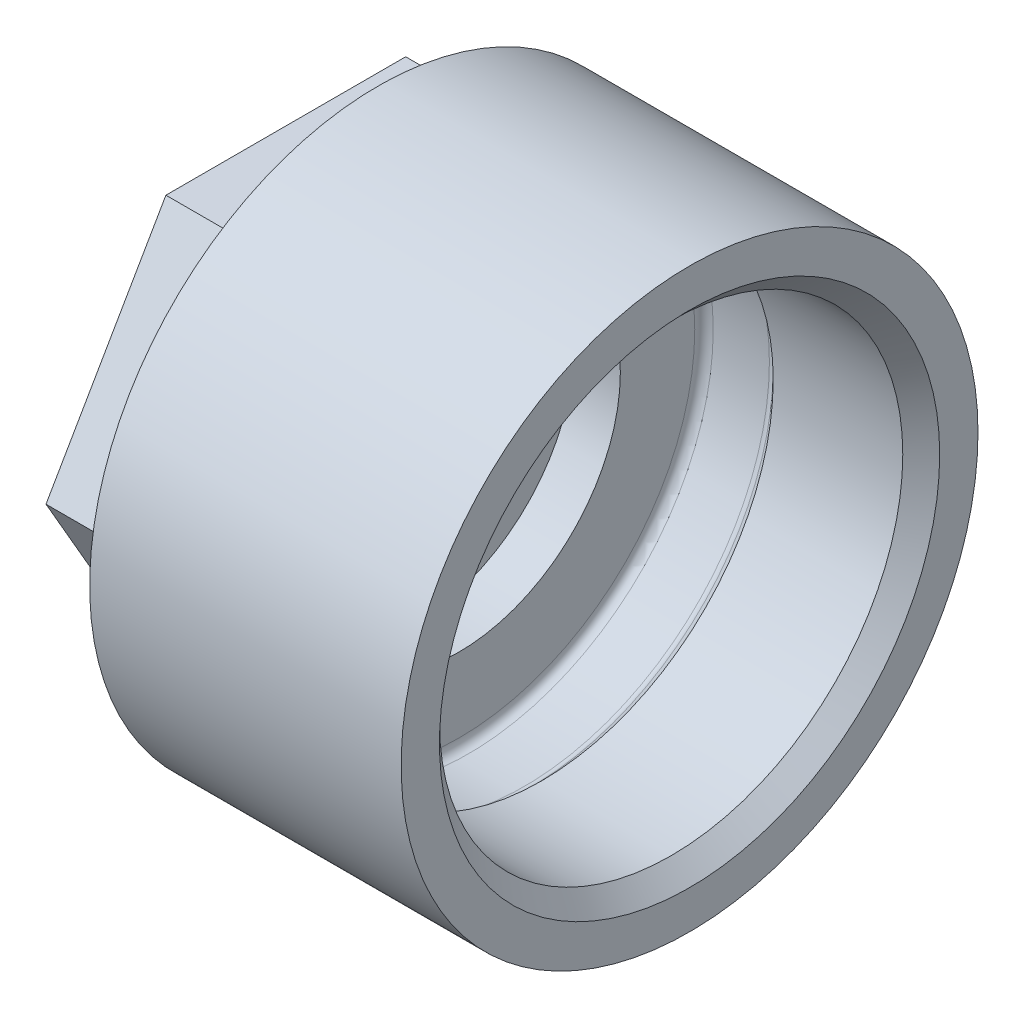
ISO-10303-21;
HEADER;
FILE_DESCRIPTION(('STEP AP214'),'2;1');
FILE_NAME('part.step','',(''),(''),'','','');
FILE_SCHEMA(('AUTOMOTIVE_DESIGN { 1 0 10303 214 1 1 1 1 }'));
ENDSEC;
DATA;
#1=APPLICATION_CONTEXT('core data for automotive mechanical design processes');
#2=APPLICATION_PROTOCOL_DEFINITION('international standard','automotive_design',2000,#1);
#3=PRODUCT_CONTEXT('',#1,'mechanical');
#4=PRODUCT('Part','Part','',(#3));
#5=PRODUCT_RELATED_PRODUCT_CATEGORY('part','',(#4));
#6=PRODUCT_DEFINITION_FORMATION('','',#4);
#7=PRODUCT_DEFINITION_CONTEXT('part definition',#1,'design');
#8=PRODUCT_DEFINITION('design','',#6,#7);
#9=PRODUCT_DEFINITION_SHAPE('','',#8);
#10=(LENGTH_UNIT() NAMED_UNIT(*) SI_UNIT(.MILLI.,.METRE.));
#11=(NAMED_UNIT(*) PLANE_ANGLE_UNIT() SI_UNIT($,.RADIAN.));
#12=(NAMED_UNIT(*) SI_UNIT($,.STERADIAN.) SOLID_ANGLE_UNIT());
#13=UNCERTAINTY_MEASURE_WITH_UNIT(LENGTH_MEASURE(1.E-05),#10,'distance_accuracy_value','');
#14=(GEOMETRIC_REPRESENTATION_CONTEXT(3) GLOBAL_UNCERTAINTY_ASSIGNED_CONTEXT((#13)) GLOBAL_UNIT_ASSIGNED_CONTEXT((#10,
#11,#12)) REPRESENTATION_CONTEXT('',''));
#15=CARTESIAN_POINT('',(0.,0.,0.));
#16=DIRECTION('',(0.,0.,1.));
#17=DIRECTION('',(1.,0.,0.));
#18=AXIS2_PLACEMENT_3D('',#15,#16,#17);
#19=CARTESIAN_POINT('',(-35.,21.,0.));
#20=DIRECTION('',(-1.,0.,0.));
#21=DIRECTION('',(0.,0.,1.));
#22=AXIS2_PLACEMENT_3D('',#19,#20,#21);
#23=PLANE('',#22);
#24=CARTESIAN_POINT('',(-35.,0.,0.));
#25=DIRECTION('',(1.,0.,0.));
#26=DIRECTION('',(0.,0.,-1.));
#27=AXIS2_PLACEMENT_3D('',#24,#25,#26);
#28=CIRCLE('',#27,2.);
#29=CARTESIAN_POINT('',(-35.,0.,-2.));
#30=VERTEX_POINT('',#29);
#31=EDGE_CURVE('E152',#30,#30,#28,.T.);
#32=ORIENTED_EDGE('',*,*,#31,.T.);
#33=EDGE_LOOP('',(#32));
#34=FACE_BOUND('',#33,.T.);
#35=DIRECTION('',(0.,0.,1.));
#36=VECTOR('',#35,1.);
#37=CARTESIAN_POINT('',(-35.,-18.,-10.3923048454133));
#38=LINE('',#37,#36);
#39=CARTESIAN_POINT('',(-35.,-18.,-10.3923048454133));
#40=VERTEX_POINT('',#39);
#41=CARTESIAN_POINT('',(-35.,-18.,10.3923048454132));
#42=VERTEX_POINT('',#41);
#43=EDGE_CURVE('E115',#40,#42,#38,.T.);
#44=ORIENTED_EDGE('',*,*,#43,.T.);
#45=DIRECTION('',(0.,0.866025403784438,0.5));
#46=VECTOR('',#45,1.);
#47=CARTESIAN_POINT('',(-35.,-18.,10.3923048454132));
#48=LINE('',#47,#46);
#49=CARTESIAN_POINT('',(-35.,0.,20.7846096908265));
#50=VERTEX_POINT('',#49);
#51=EDGE_CURVE('E129',#42,#50,#48,.T.);
#52=ORIENTED_EDGE('',*,*,#51,.T.);
#53=DIRECTION('',(0.,0.866025403784439,-0.499999999999999));
#54=VECTOR('',#53,1.);
#55=CARTESIAN_POINT('',(-35.,0.,20.7846096908265));
#56=LINE('',#55,#54);
#57=CARTESIAN_POINT('',(-35.,18.,10.3923048454133));
#58=VERTEX_POINT('',#57);
#59=EDGE_CURVE('E99',#50,#58,#56,.T.);
#60=ORIENTED_EDGE('',*,*,#59,.T.);
#61=DIRECTION('',(0.,0.,-1.));
#62=VECTOR('',#61,1.);
#63=CARTESIAN_POINT('',(-35.,18.,10.3923048454133));
#64=LINE('',#63,#62);
#65=CARTESIAN_POINT('',(-35.,18.,-10.3923048454132));
#66=VERTEX_POINT('',#65);
#67=EDGE_CURVE('E55',#58,#66,#64,.T.);
#68=ORIENTED_EDGE('',*,*,#67,.T.);
#69=DIRECTION('',(0.,-0.866025403784438,-0.5));
#70=VECTOR('',#69,1.);
#71=CARTESIAN_POINT('',(-35.,18.,-10.3923048454132));
#72=LINE('',#71,#70);
#73=CARTESIAN_POINT('',(-35.,0.,-20.7846096908265));
#74=VERTEX_POINT('',#73);
#75=EDGE_CURVE('E133',#66,#74,#72,.T.);
#76=ORIENTED_EDGE('',*,*,#75,.T.);
#77=DIRECTION('',(0.,-0.866025403784439,0.5));
#78=VECTOR('',#77,1.);
#79=CARTESIAN_POINT('',(-35.,0.,-20.7846096908265));
#80=LINE('',#79,#78);
#81=EDGE_CURVE('E118',#74,#40,#80,.T.);
#82=ORIENTED_EDGE('',*,*,#81,.T.);
#83=EDGE_LOOP('',(#44,#52,#60,#68,#76,#82));
#84=FACE_BOUND('',#83,.T.);
#85=ADVANCED_FACE('F39',(#34,#84),#23,.T.);
#86=CARTESIAN_POINT('',(0.,0.,0.));
#87=DIRECTION('',(1.,0.,0.));
#88=DIRECTION('',(0.,0.,-1.));
#89=AXIS2_PLACEMENT_3D('',#86,#87,#88);
#90=CYLINDRICAL_SURFACE('',#89,21.);
#91=CARTESIAN_POINT('',(-27.,0.,0.));
#92=DIRECTION('',(1.,0.,0.));
#93=DIRECTION('',(0.,0.,-1.));
#94=AXIS2_PLACEMENT_3D('',#91,#92,#93);
#95=CIRCLE('',#94,21.);
#96=CARTESIAN_POINT('',(-27.,0.,-21.));
#97=VERTEX_POINT('',#96);
#98=EDGE_CURVE('E149',#97,#97,#95,.T.);
#99=ORIENTED_EDGE('',*,*,#98,.F.);
#100=EDGE_LOOP('',(#99));
#101=FACE_BOUND('',#100,.T.);
#102=CARTESIAN_POINT('',(-28.,0.,0.));
#103=DIRECTION('',(-1.,0.,0.));
#104=DIRECTION('',(0.,0.,1.));
#105=AXIS2_PLACEMENT_3D('',#102,#103,#104);
#106=CIRCLE('',#105,21.);
#107=CARTESIAN_POINT('',(-28.,0.,21.));
#108=VERTEX_POINT('',#107);
#109=EDGE_CURVE('E43',#108,#108,#106,.F.);
#110=ORIENTED_EDGE('',*,*,#109,.T.);
#111=EDGE_LOOP('',(#110));
#112=FACE_BOUND('',#111,.T.);
#113=ADVANCED_FACE('F197',(#101,#112),#90,.T.);
#114=CARTESIAN_POINT('',(0.,0.,0.));
#115=DIRECTION('',(1.,0.,0.));
#116=DIRECTION('',(0.,0.,-1.));
#117=AXIS2_PLACEMENT_3D('',#114,#115,#116);
#118=CYLINDRICAL_SURFACE('',#117,25.);
#119=CARTESIAN_POINT('',(-27.,0.,0.));
#120=DIRECTION('',(1.,0.,0.));
#121=DIRECTION('',(0.,0.,-1.));
#122=AXIS2_PLACEMENT_3D('',#119,#120,#121);
#123=CIRCLE('',#122,25.);
#124=CARTESIAN_POINT('',(-27.,0.,-25.));
#125=VERTEX_POINT('',#124);
#126=EDGE_CURVE('E146',#125,#125,#123,.T.);
#127=ORIENTED_EDGE('',*,*,#126,.T.);
#128=EDGE_LOOP('',(#127));
#129=FACE_BOUND('',#128,.T.);
#130=CARTESIAN_POINT('',(0.,0.,0.));
#131=DIRECTION('',(1.,0.,0.));
#132=DIRECTION('',(0.,0.,-1.));
#133=AXIS2_PLACEMENT_3D('',#130,#131,#132);
#134=CIRCLE('',#133,25.);
#135=CARTESIAN_POINT('',(0.,0.,-25.));
#136=VERTEX_POINT('',#135);
#137=EDGE_CURVE('E12',#136,#136,#134,.T.);
#138=ORIENTED_EDGE('',*,*,#137,.F.);
#139=EDGE_LOOP('',(#138));
#140=FACE_BOUND('',#139,.T.);
#141=ADVANCED_FACE('F41',(#129,#140),#118,.T.);
#142=CARTESIAN_POINT('',(0.,21.68,0.));
#143=DIRECTION('',(1.,0.,0.));
#144=DIRECTION('',(0.,0.,-1.));
#145=AXIS2_PLACEMENT_3D('',#142,#143,#144);
#146=PLANE('',#145);
#147=ORIENTED_EDGE('',*,*,#137,.T.);
#148=EDGE_LOOP('',(#147));
#149=FACE_BOUND('',#148,.T.);
#150=CARTESIAN_POINT('',(0.,0.,0.));
#151=DIRECTION('',(1.,0.,0.));
#152=DIRECTION('',(0.,0.,-1.));
#153=AXIS2_PLACEMENT_3D('',#150,#151,#152);
#154=CIRCLE('',#153,21.68);
#155=CARTESIAN_POINT('',(0.,0.,-21.68));
#156=VERTEX_POINT('',#155);
#157=EDGE_CURVE('E48',#156,#156,#154,.T.);
#158=ORIENTED_EDGE('',*,*,#157,.F.);
#159=EDGE_LOOP('',(#158));
#160=FACE_BOUND('',#159,.T.);
#161=ADVANCED_FACE('F188',(#149,#160),#146,.T.);
#162=CARTESIAN_POINT('',(-1.6,0.,0.));
#163=DIRECTION('',(1.,0.,0.));
#164=DIRECTION('',(0.,0.,-1.));
#165=AXIS2_PLACEMENT_3D('',#162,#163,#164);
#166=CONICAL_SURFACE('',#165,20.08,0.785398163397445);
#167=ORIENTED_EDGE('',*,*,#157,.T.);
#168=EDGE_LOOP('',(#167));
#169=FACE_BOUND('',#168,.T.);
#170=CARTESIAN_POINT('',(-1.6,0.,0.));
#171=DIRECTION('',(1.,0.,0.));
#172=DIRECTION('',(0.,0.,-1.));
#173=AXIS2_PLACEMENT_3D('',#170,#171,#172);
#174=CIRCLE('',#173,20.08);
#175=CARTESIAN_POINT('',(-1.6,0.,-20.08));
#176=VERTEX_POINT('',#175);
#177=EDGE_CURVE('E179',#176,#176,#174,.T.);
#178=ORIENTED_EDGE('',*,*,#177,.F.);
#179=EDGE_LOOP('',(#178));
#180=FACE_BOUND('',#179,.T.);
#181=ADVANCED_FACE('F185',(#169,#180),#166,.F.);
#182=CARTESIAN_POINT('',(0.,0.,0.));
#183=DIRECTION('',(1.,0.,0.));
#184=DIRECTION('',(0.,0.,-1.));
#185=AXIS2_PLACEMENT_3D('',#182,#183,#184);
#186=CYLINDRICAL_SURFACE('',#185,20.08);
#187=ORIENTED_EDGE('',*,*,#177,.T.);
#188=EDGE_LOOP('',(#187));
#189=FACE_BOUND('',#188,.T.);
#190=CARTESIAN_POINT('',(-12.83,0.,0.));
#191=DIRECTION('',(1.,0.,0.));
#192=DIRECTION('',(0.,0.,-1.));
#193=AXIS2_PLACEMENT_3D('',#190,#191,#192);
#194=CIRCLE('',#193,20.08);
#195=CARTESIAN_POINT('',(-12.83,0.,-20.08));
#196=VERTEX_POINT('',#195);
#197=EDGE_CURVE('E176',#196,#196,#194,.T.);
#198=ORIENTED_EDGE('',*,*,#197,.F.);
#199=EDGE_LOOP('',(#198));
#200=FACE_BOUND('',#199,.T.);
#201=ADVANCED_FACE('F195',(#189,#200),#186,.F.);
#202=CARTESIAN_POINT('',(-13.7656854249492,0.,0.));
#203=DIRECTION('',(-1.,0.,0.));
#204=DIRECTION('',(0.,0.,1.));
#205=AXIS2_PLACEMENT_3D('',#202,#203,#204);
#206=CONICAL_SURFACE('',#205,21.0156854249492,0.785398163397451);
#207=ORIENTED_EDGE('',*,*,#197,.T.);
#208=EDGE_LOOP('',(#207));
#209=FACE_BOUND('',#208,.T.);
#210=CARTESIAN_POINT('',(-13.7656854249492,0.,0.));
#211=DIRECTION('',(1.,0.,0.));
#212=DIRECTION('',(0.,0.,-1.));
#213=AXIS2_PLACEMENT_3D('',#210,#211,#212);
#214=CIRCLE('',#213,21.0156854249492);
#215=CARTESIAN_POINT('',(-13.7656854249492,0.,-21.0156854249492));
#216=VERTEX_POINT('',#215);
#217=EDGE_CURVE('E173',#216,#216,#214,.T.);
#218=ORIENTED_EDGE('',*,*,#217,.F.);
#219=EDGE_LOOP('',(#218));
#220=FACE_BOUND('',#219,.T.);
#221=ADVANCED_FACE('F238',(#209,#220),#206,.F.);
#222=CARTESIAN_POINT('',(-14.3313708498985,0.,0.));
#223=DIRECTION('',(1.,0.,0.));
#224=DIRECTION('',(0.,0.,-1.));
#225=AXIS2_PLACEMENT_3D('',#222,#223,#224);
#226=TOROIDAL_SURFACE('',#225,20.45,0.799999999999999);
#227=ORIENTED_EDGE('',*,*,#217,.T.);
#228=EDGE_LOOP('',(#227));
#229=FACE_BOUND('',#228,.T.);
#230=CARTESIAN_POINT('',(-14.3313708498985,0.,0.));
#231=DIRECTION('',(1.,0.,0.));
#232=DIRECTION('',(0.,0.,-1.));
#233=AXIS2_PLACEMENT_3D('',#230,#231,#232);
#234=CIRCLE('',#233,21.25);
#235=CARTESIAN_POINT('',(-14.3313708498985,0.,-21.25));
#236=VERTEX_POINT('',#235);
#237=EDGE_CURVE('E170',#236,#236,#234,.T.);
#238=ORIENTED_EDGE('',*,*,#237,.F.);
#239=EDGE_LOOP('',(#238));
#240=FACE_BOUND('',#239,.T.);
#241=ADVANCED_FACE('F234',(#229,#240),#226,.F.);
#242=CARTESIAN_POINT('',(0.,0.,0.));
#243=DIRECTION('',(1.,0.,0.));
#244=DIRECTION('',(0.,0.,-1.));
#245=AXIS2_PLACEMENT_3D('',#242,#243,#244);
#246=CYLINDRICAL_SURFACE('',#245,21.25);
#247=ORIENTED_EDGE('',*,*,#237,.T.);
#248=EDGE_LOOP('',(#247));
#249=FACE_BOUND('',#248,.T.);
#250=CARTESIAN_POINT('',(-19.2,0.,0.));
#251=DIRECTION('',(1.,0.,0.));
#252=DIRECTION('',(0.,0.,-1.));
#253=AXIS2_PLACEMENT_3D('',#250,#251,#252);
#254=CIRCLE('',#253,21.25);
#255=CARTESIAN_POINT('',(-19.2,0.,-21.25));
#256=VERTEX_POINT('',#255);
#257=EDGE_CURVE('E167',#256,#256,#254,.T.);
#258=ORIENTED_EDGE('',*,*,#257,.F.);
#259=EDGE_LOOP('',(#258));
#260=FACE_BOUND('',#259,.T.);
#261=ADVANCED_FACE('F230',(#249,#260),#246,.F.);
#262=CARTESIAN_POINT('',(-19.2,0.,0.));
#263=DIRECTION('',(1.,0.,0.));
#264=DIRECTION('',(0.,0.,-1.));
#265=AXIS2_PLACEMENT_3D('',#262,#263,#264);
#266=TOROIDAL_SURFACE('',#265,20.45,0.799999999999999);
#267=ORIENTED_EDGE('',*,*,#257,.T.);
#268=EDGE_LOOP('',(#267));
#269=FACE_BOUND('',#268,.T.);
#270=CARTESIAN_POINT('',(-20.,0.,0.));
#271=DIRECTION('',(1.,0.,0.));
#272=DIRECTION('',(0.,0.,-1.));
#273=AXIS2_PLACEMENT_3D('',#270,#271,#272);
#274=CIRCLE('',#273,20.45);
#275=CARTESIAN_POINT('',(-20.,0.,-20.45));
#276=VERTEX_POINT('',#275);
#277=EDGE_CURVE('E164',#276,#276,#274,.T.);
#278=ORIENTED_EDGE('',*,*,#277,.F.);
#279=EDGE_LOOP('',(#278));
#280=FACE_BOUND('',#279,.T.);
#281=ADVANCED_FACE('F226',(#269,#280),#266,.F.);
#282=CARTESIAN_POINT('',(-20.,14.,0.));
#283=DIRECTION('',(1.,0.,0.));
#284=DIRECTION('',(0.,0.,-1.));
#285=AXIS2_PLACEMENT_3D('',#282,#283,#284);
#286=PLANE('',#285);
#287=ORIENTED_EDGE('',*,*,#277,.T.);
#288=EDGE_LOOP('',(#287));
#289=FACE_BOUND('',#288,.T.);
#290=CARTESIAN_POINT('',(-20.,0.,0.));
#291=DIRECTION('',(1.,0.,0.));
#292=DIRECTION('',(0.,0.,-1.));
#293=AXIS2_PLACEMENT_3D('',#290,#291,#292);
#294=CIRCLE('',#293,14.);
#295=CARTESIAN_POINT('',(-20.,0.,-14.));
#296=VERTEX_POINT('',#295);
#297=EDGE_CURVE('E161',#296,#296,#294,.T.);
#298=ORIENTED_EDGE('',*,*,#297,.F.);
#299=EDGE_LOOP('',(#298));
#300=FACE_BOUND('',#299,.T.);
#301=ADVANCED_FACE('F222',(#289,#300),#286,.T.);
#302=CARTESIAN_POINT('',(0.,0.,0.));
#303=DIRECTION('',(1.,0.,0.));
#304=DIRECTION('',(0.,0.,-1.));
#305=AXIS2_PLACEMENT_3D('',#302,#303,#304);
#306=CYLINDRICAL_SURFACE('',#305,14.);
#307=ORIENTED_EDGE('',*,*,#297,.T.);
#308=EDGE_LOOP('',(#307));
#309=FACE_BOUND('',#308,.T.);
#310=CARTESIAN_POINT('',(-24.,0.,0.));
#311=DIRECTION('',(1.,0.,0.));
#312=DIRECTION('',(0.,0.,-1.));
#313=AXIS2_PLACEMENT_3D('',#310,#311,#312);
#314=CIRCLE('',#313,14.);
#315=CARTESIAN_POINT('',(-24.,0.,-14.));
#316=VERTEX_POINT('',#315);
#317=EDGE_CURVE('E158',#316,#316,#314,.T.);
#318=ORIENTED_EDGE('',*,*,#317,.F.);
#319=EDGE_LOOP('',(#318));
#320=FACE_BOUND('',#319,.T.);
#321=ADVANCED_FACE('F218',(#309,#320),#306,.F.);
#322=CARTESIAN_POINT('',(-24.,2.,0.));
#323=DIRECTION('',(1.,0.,0.));
#324=DIRECTION('',(0.,0.,-1.));
#325=AXIS2_PLACEMENT_3D('',#322,#323,#324);
#326=PLANE('',#325);
#327=ORIENTED_EDGE('',*,*,#317,.T.);
#328=EDGE_LOOP('',(#327));
#329=FACE_BOUND('',#328,.T.);
#330=CARTESIAN_POINT('',(-24.,0.,0.));
#331=DIRECTION('',(1.,0.,0.));
#332=DIRECTION('',(0.,0.,-1.));
#333=AXIS2_PLACEMENT_3D('',#330,#331,#332);
#334=CIRCLE('',#333,2.);
#335=CARTESIAN_POINT('',(-24.,0.,-2.));
#336=VERTEX_POINT('',#335);
#337=EDGE_CURVE('E155',#336,#336,#334,.T.);
#338=ORIENTED_EDGE('',*,*,#337,.F.);
#339=EDGE_LOOP('',(#338));
#340=FACE_BOUND('',#339,.T.);
#341=ADVANCED_FACE('F214',(#329,#340),#326,.T.);
#342=CARTESIAN_POINT('',(0.,0.,0.));
#343=DIRECTION('',(1.,0.,0.));
#344=DIRECTION('',(0.,0.,-1.));
#345=AXIS2_PLACEMENT_3D('',#342,#343,#344);
#346=CYLINDRICAL_SURFACE('',#345,2.);
#347=ORIENTED_EDGE('',*,*,#337,.T.);
#348=EDGE_LOOP('',(#347));
#349=FACE_BOUND('',#348,.T.);
#350=ORIENTED_EDGE('',*,*,#31,.F.);
#351=EDGE_LOOP('',(#350));
#352=FACE_BOUND('',#351,.T.);
#353=ADVANCED_FACE('F210',(#349,#352),#346,.F.);
#354=CARTESIAN_POINT('',(-27.,25.,0.));
#355=DIRECTION('',(-1.,0.,0.));
#356=DIRECTION('',(0.,0.,1.));
#357=AXIS2_PLACEMENT_3D('',#354,#355,#356);
#358=PLANE('',#357);
#359=ORIENTED_EDGE('',*,*,#98,.T.);
#360=EDGE_LOOP('',(#359));
#361=FACE_BOUND('',#360,.T.);
#362=ORIENTED_EDGE('',*,*,#126,.F.);
#363=EDGE_LOOP('',(#362));
#364=FACE_BOUND('',#363,.T.);
#365=ADVANCED_FACE('F213',(#361,#364),#358,.T.);
#366=CARTESIAN_POINT('',(-28.,0.,0.));
#367=DIRECTION('',(-1.,0.,0.));
#368=DIRECTION('',(0.,0.,1.));
#369=AXIS2_PLACEMENT_3D('',#366,#367,#368);
#370=PLANE('',#369);
#371=ORIENTED_EDGE('',*,*,#109,.F.);
#372=EDGE_LOOP('',(#371));
#373=FACE_BOUND('',#372,.T.);
#374=DIRECTION('',(0.,0.,1.));
#375=VECTOR('',#374,1.);
#376=CARTESIAN_POINT('',(-28.,-18.,-10.3923048454133));
#377=LINE('',#376,#375);
#378=CARTESIAN_POINT('',(-28.,-18.,-10.3923048454133));
#379=VERTEX_POINT('',#378);
#380=CARTESIAN_POINT('',(-28.,-18.,10.3923048454132));
#381=VERTEX_POINT('',#380);
#382=EDGE_CURVE('E105',#379,#381,#377,.T.);
#383=ORIENTED_EDGE('',*,*,#382,.F.);
#384=DIRECTION('',(0.,-0.866025403784439,0.5));
#385=VECTOR('',#384,1.);
#386=CARTESIAN_POINT('',(-28.,0.,-20.7846096908265));
#387=LINE('',#386,#385);
#388=CARTESIAN_POINT('',(-28.,0.,-20.7846096908265));
#389=VERTEX_POINT('',#388);
#390=EDGE_CURVE('E125',#389,#379,#387,.T.);
#391=ORIENTED_EDGE('',*,*,#390,.F.);
#392=DIRECTION('',(0.,-0.866025403784438,-0.5));
#393=VECTOR('',#392,1.);
#394=CARTESIAN_POINT('',(-28.,18.,-10.3923048454132));
#395=LINE('',#394,#393);
#396=CARTESIAN_POINT('',(-28.,18.,-10.3923048454132));
#397=VERTEX_POINT('',#396);
#398=EDGE_CURVE('E122',#397,#389,#395,.T.);
#399=ORIENTED_EDGE('',*,*,#398,.F.);
#400=DIRECTION('',(0.,0.,-1.));
#401=VECTOR('',#400,1.);
#402=CARTESIAN_POINT('',(-28.,18.,10.3923048454133));
#403=LINE('',#402,#401);
#404=CARTESIAN_POINT('',(-28.,18.,10.3923048454133));
#405=VERTEX_POINT('',#404);
#406=EDGE_CURVE('E63',#405,#397,#403,.T.);
#407=ORIENTED_EDGE('',*,*,#406,.F.);
#408=DIRECTION('',(0.,0.866025403784439,-0.499999999999999));
#409=VECTOR('',#408,1.);
#410=CARTESIAN_POINT('',(-28.,0.,20.7846096908265));
#411=LINE('',#410,#409);
#412=CARTESIAN_POINT('',(-28.,0.,20.7846096908265));
#413=VERTEX_POINT('',#412);
#414=EDGE_CURVE('E97',#413,#405,#411,.T.);
#415=ORIENTED_EDGE('',*,*,#414,.F.);
#416=DIRECTION('',(0.,0.866025403784438,0.5));
#417=VECTOR('',#416,1.);
#418=CARTESIAN_POINT('',(-28.,-18.,10.3923048454132));
#419=LINE('',#418,#417);
#420=EDGE_CURVE('E110',#381,#413,#419,.T.);
#421=ORIENTED_EDGE('',*,*,#420,.F.);
#422=EDGE_LOOP('',(#383,#391,#399,#407,#415,#421));
#423=FACE_BOUND('',#422,.T.);
#424=ADVANCED_FACE('F109',(#373,#423),#370,.T.);
#425=CARTESIAN_POINT('',(-28.,-18.,10.3923048454132));
#426=DIRECTION('',(0.,-0.5,0.866025403784438));
#427=DIRECTION('',(0.,-0.866025403784438,-0.5));
#428=AXIS2_PLACEMENT_3D('',#425,#426,#427);
#429=PLANE('',#428);
#430=ORIENTED_EDGE('',*,*,#51,.F.);
#431=DIRECTION('',(-1.,0.,0.));
#432=VECTOR('',#431,1.);
#433=CARTESIAN_POINT('',(-28.,-18.,10.3923048454132));
#434=LINE('',#433,#432);
#435=EDGE_CURVE('E114',#381,#42,#434,.T.);
#436=ORIENTED_EDGE('',*,*,#435,.F.);
#437=ORIENTED_EDGE('',*,*,#420,.T.);
#438=DIRECTION('',(-1.,0.,0.));
#439=VECTOR('',#438,1.);
#440=CARTESIAN_POINT('',(-28.,0.,20.7846096908265));
#441=LINE('',#440,#439);
#442=EDGE_CURVE('E95',#413,#50,#441,.T.);
#443=ORIENTED_EDGE('',*,*,#442,.T.);
#444=EDGE_LOOP('',(#430,#436,#437,#443));
#445=FACE_BOUND('',#444,.T.);
#446=ADVANCED_FACE('F113',(#445),#429,.T.);
#447=CARTESIAN_POINT('',(-28.,-18.,-10.3923048454133));
#448=DIRECTION('',(0.,-1.,0.));
#449=DIRECTION('',(0.,0.,-1.));
#450=AXIS2_PLACEMENT_3D('',#447,#448,#449);
#451=PLANE('',#450);
#452=ORIENTED_EDGE('',*,*,#43,.F.);
#453=DIRECTION('',(-1.,0.,0.));
#454=VECTOR('',#453,1.);
#455=CARTESIAN_POINT('',(-28.,-18.,-10.3923048454133));
#456=LINE('',#455,#454);
#457=EDGE_CURVE('E139',#379,#40,#456,.T.);
#458=ORIENTED_EDGE('',*,*,#457,.F.);
#459=ORIENTED_EDGE('',*,*,#382,.T.);
#460=ORIENTED_EDGE('',*,*,#435,.T.);
#461=EDGE_LOOP('',(#452,#458,#459,#460));
#462=FACE_BOUND('',#461,.T.);
#463=ADVANCED_FACE('F320',(#462),#451,.T.);
#464=CARTESIAN_POINT('',(-28.,0.,-20.7846096908265));
#465=DIRECTION('',(0.,-0.5,-0.866025403784439));
#466=DIRECTION('',(0.,0.866025403784439,-0.5));
#467=AXIS2_PLACEMENT_3D('',#464,#465,#466);
#468=PLANE('',#467);
#469=ORIENTED_EDGE('',*,*,#81,.F.);
#470=DIRECTION('',(-1.,0.,0.));
#471=VECTOR('',#470,1.);
#472=CARTESIAN_POINT('',(-28.,0.,-20.7846096908265));
#473=LINE('',#472,#471);
#474=EDGE_CURVE('E141',#389,#74,#473,.T.);
#475=ORIENTED_EDGE('',*,*,#474,.F.);
#476=ORIENTED_EDGE('',*,*,#390,.T.);
#477=ORIENTED_EDGE('',*,*,#457,.T.);
#478=EDGE_LOOP('',(#469,#475,#476,#477));
#479=FACE_BOUND('',#478,.T.);
#480=ADVANCED_FACE('F327',(#479),#468,.T.);
#481=CARTESIAN_POINT('',(-28.,18.,-10.3923048454132));
#482=DIRECTION('',(0.,0.5,-0.866025403784438));
#483=DIRECTION('',(0.,0.866025403784439,0.5));
#484=AXIS2_PLACEMENT_3D('',#481,#482,#483);
#485=PLANE('',#484);
#486=ORIENTED_EDGE('',*,*,#75,.F.);
#487=DIRECTION('',(-1.,0.,0.));
#488=VECTOR('',#487,1.);
#489=CARTESIAN_POINT('',(-28.,18.,-10.3923048454132));
#490=LINE('',#489,#488);
#491=EDGE_CURVE('E143',#397,#66,#490,.T.);
#492=ORIENTED_EDGE('',*,*,#491,.F.);
#493=ORIENTED_EDGE('',*,*,#398,.T.);
#494=ORIENTED_EDGE('',*,*,#474,.T.);
#495=EDGE_LOOP('',(#486,#492,#493,#494));
#496=FACE_BOUND('',#495,.T.);
#497=ADVANCED_FACE('F335',(#496),#485,.T.);
#498=CARTESIAN_POINT('',(-28.,18.,10.3923048454133));
#499=DIRECTION('',(0.,1.,0.));
#500=DIRECTION('',(0.,0.,1.));
#501=AXIS2_PLACEMENT_3D('',#498,#499,#500);
#502=PLANE('',#501);
#503=ORIENTED_EDGE('',*,*,#67,.F.);
#504=DIRECTION('',(-1.,0.,0.));
#505=VECTOR('',#504,1.);
#506=CARTESIAN_POINT('',(-28.,18.,10.3923048454133));
#507=LINE('',#506,#505);
#508=EDGE_CURVE('E104',#405,#58,#507,.T.);
#509=ORIENTED_EDGE('',*,*,#508,.F.);
#510=ORIENTED_EDGE('',*,*,#406,.T.);
#511=ORIENTED_EDGE('',*,*,#491,.T.);
#512=EDGE_LOOP('',(#503,#509,#510,#511));
#513=FACE_BOUND('',#512,.T.);
#514=ADVANCED_FACE('F343',(#513),#502,.T.);
#515=CARTESIAN_POINT('',(-28.,0.,20.7846096908265));
#516=DIRECTION('',(0.,0.499999999999999,0.866025403784439));
#517=DIRECTION('',(0.,-0.866025403784439,0.499999999999999));
#518=AXIS2_PLACEMENT_3D('',#515,#516,#517);
#519=PLANE('',#518);
#520=ORIENTED_EDGE('',*,*,#59,.F.);
#521=ORIENTED_EDGE('',*,*,#442,.F.);
#522=ORIENTED_EDGE('',*,*,#414,.T.);
#523=ORIENTED_EDGE('',*,*,#508,.T.);
#524=EDGE_LOOP('',(#520,#521,#522,#523));
#525=FACE_BOUND('',#524,.T.);
#526=ADVANCED_FACE('F96',(#525),#519,.T.);
#527=CLOSED_SHELL('',(#85,#113,#141,#161,#181,#201,#221,#241,#261,#281,#301,#321,#341,#353,#365,
#424,#446,#463,#480,#497,#514,#526));
#528=MANIFOLD_SOLID_BREP('B2',#527);
#529=ADVANCED_BREP_SHAPE_REPRESENTATION('',(#18,#528),#14);
#530=SHAPE_DEFINITION_REPRESENTATION(#9,#529);
ENDSEC;
END-ISO-10303-21;
